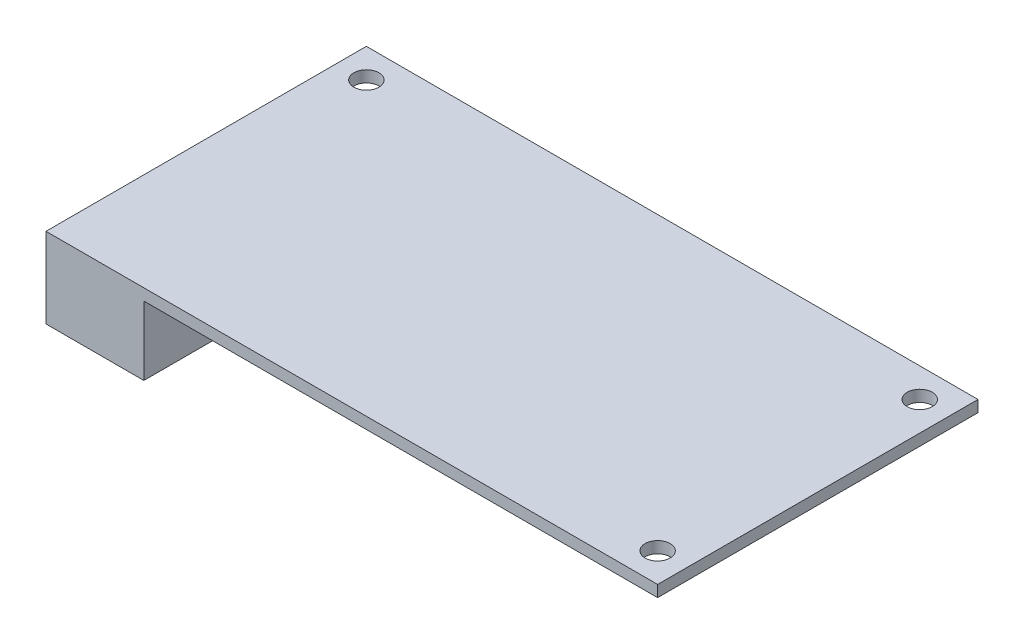
ISO-10303-21;
HEADER;
FILE_DESCRIPTION(('STEP AP214'),'2;1');
FILE_NAME('part.step','',(''),(''),'','','');
FILE_SCHEMA(('AUTOMOTIVE_DESIGN { 1 0 10303 214 1 1 1 1 }'));
ENDSEC;
DATA;
#1=APPLICATION_CONTEXT('core data for automotive mechanical design processes');
#2=APPLICATION_PROTOCOL_DEFINITION('international standard','automotive_design',2000,#1);
#3=PRODUCT_CONTEXT('',#1,'mechanical');
#4=PRODUCT('Part','Part','',(#3));
#5=PRODUCT_RELATED_PRODUCT_CATEGORY('part','',(#4));
#6=PRODUCT_DEFINITION_FORMATION('','',#4);
#7=PRODUCT_DEFINITION_CONTEXT('part definition',#1,'design');
#8=PRODUCT_DEFINITION('design','',#6,#7);
#9=PRODUCT_DEFINITION_SHAPE('','',#8);
#10=(LENGTH_UNIT() NAMED_UNIT(*) SI_UNIT(.MILLI.,.METRE.));
#11=(NAMED_UNIT(*) PLANE_ANGLE_UNIT() SI_UNIT($,.RADIAN.));
#12=(NAMED_UNIT(*) SI_UNIT($,.STERADIAN.) SOLID_ANGLE_UNIT());
#13=UNCERTAINTY_MEASURE_WITH_UNIT(LENGTH_MEASURE(1.E-05),#10,'distance_accuracy_value','');
#14=(GEOMETRIC_REPRESENTATION_CONTEXT(3) GLOBAL_UNCERTAINTY_ASSIGNED_CONTEXT((#13)) GLOBAL_UNIT_ASSIGNED_CONTEXT((#10,
#11,#12)) REPRESENTATION_CONTEXT('',''));
#15=CARTESIAN_POINT('',(0.,0.,0.));
#16=DIRECTION('',(0.,0.,1.));
#17=DIRECTION('',(1.,0.,0.));
#18=AXIS2_PLACEMENT_3D('',#15,#16,#17);
#19=CARTESIAN_POINT('',(0.,1.,0.));
#20=DIRECTION('',(0.,-1.,0.));
#21=DIRECTION('',(0.,0.,-1.));
#22=AXIS2_PLACEMENT_3D('',#19,#20,#21);
#23=PLANE('',#22);
#24=DIRECTION('',(-1.,0.,0.));
#25=VECTOR('',#24,1.);
#26=CARTESIAN_POINT('',(-26.67,1.,-13.97));
#27=LINE('',#26,#25);
#28=CARTESIAN_POINT('',(26.67,1.,-13.97));
#29=VERTEX_POINT('',#28);
#30=CARTESIAN_POINT('',(-26.67,1.,-13.97));
#31=VERTEX_POINT('',#30);
#32=EDGE_CURVE('E196',#29,#31,#27,.T.);
#33=ORIENTED_EDGE('',*,*,#32,.T.);
#34=DIRECTION('',(0.,0.,1.));
#35=VECTOR('',#34,1.);
#36=CARTESIAN_POINT('',(-26.67,1.,13.97));
#37=LINE('',#36,#35);
#38=CARTESIAN_POINT('',(-26.67,1.,13.97));
#39=VERTEX_POINT('',#38);
#40=EDGE_CURVE('E199',#31,#39,#37,.T.);
#41=ORIENTED_EDGE('',*,*,#40,.T.);
#42=DIRECTION('',(1.,0.,0.));
#43=VECTOR('',#42,1.);
#44=CARTESIAN_POINT('',(-26.67,1.,13.97));
#45=LINE('',#44,#43);
#46=CARTESIAN_POINT('',(26.67,1.,13.97));
#47=VERTEX_POINT('',#46);
#48=EDGE_CURVE('E201',#39,#47,#45,.T.);
#49=ORIENTED_EDGE('',*,*,#48,.T.);
#50=DIRECTION('',(0.,0.,-1.));
#51=VECTOR('',#50,1.);
#52=CARTESIAN_POINT('',(26.67,1.,13.97));
#53=LINE('',#52,#51);
#54=EDGE_CURVE('E193',#47,#29,#53,.T.);
#55=ORIENTED_EDGE('',*,*,#54,.T.);
#56=EDGE_LOOP('',(#33,#41,#49,#55));
#57=FACE_BOUND('',#56,.T.);
#58=CARTESIAN_POINT('',(-24.13,1.,-11.43));
#59=DIRECTION('',(0.,1.,0.));
#60=DIRECTION('',(0.,0.,1.));
#61=AXIS2_PLACEMENT_3D('',#58,#59,#60);
#62=CIRCLE('',#61,1.0922);
#63=CARTESIAN_POINT('',(-24.13,1.,-10.3378));
#64=VERTEX_POINT('',#63);
#65=EDGE_CURVE('E187',#64,#64,#62,.T.);
#66=ORIENTED_EDGE('',*,*,#65,.F.);
#67=EDGE_LOOP('',(#66));
#68=FACE_BOUND('',#67,.T.);
#69=CARTESIAN_POINT('',(24.13,1.,-11.43));
#70=DIRECTION('',(0.,1.,0.));
#71=DIRECTION('',(0.,0.,1.));
#72=AXIS2_PLACEMENT_3D('',#69,#70,#71);
#73=CIRCLE('',#72,1.0922);
#74=CARTESIAN_POINT('',(24.13,1.,-10.3378));
#75=VERTEX_POINT('',#74);
#76=EDGE_CURVE('E181',#75,#75,#73,.T.);
#77=ORIENTED_EDGE('',*,*,#76,.F.);
#78=EDGE_LOOP('',(#77));
#79=FACE_BOUND('',#78,.T.);
#80=CARTESIAN_POINT('',(24.13,1.,11.43));
#81=DIRECTION('',(0.,1.,0.));
#82=DIRECTION('',(0.,0.,1.));
#83=AXIS2_PLACEMENT_3D('',#80,#81,#82);
#84=CIRCLE('',#83,1.0922);
#85=CARTESIAN_POINT('',(24.13,1.,12.5222));
#86=VERTEX_POINT('',#85);
#87=EDGE_CURVE('E175',#86,#86,#84,.T.);
#88=ORIENTED_EDGE('',*,*,#87,.F.);
#89=EDGE_LOOP('',(#88));
#90=FACE_BOUND('',#89,.T.);
#91=ADVANCED_FACE('F34',(#57,#68,#79,#90),#23,.F.);
#92=CARTESIAN_POINT('',(0.,0.,0.));
#93=DIRECTION('',(0.,-1.,0.));
#94=DIRECTION('',(0.,0.,-1.));
#95=AXIS2_PLACEMENT_3D('',#92,#93,#94);
#96=PLANE('',#95);
#97=DIRECTION('',(0.,0.,-1.));
#98=VECTOR('',#97,1.);
#99=CARTESIAN_POINT('',(-5.18182766884214,0.,0.));
#100=LINE('',#99,#98);
#101=CARTESIAN_POINT('',(-5.18182766884214,0.,-6.44129967168573));
#102=VERTEX_POINT('',#101);
#103=CARTESIAN_POINT('',(-5.18182766884214,0.,-13.97));
#104=VERTEX_POINT('',#103);
#105=EDGE_CURVE('E148',#102,#104,#100,.T.);
#106=ORIENTED_EDGE('',*,*,#105,.F.);
#107=DIRECTION('',(-1.,0.,0.));
#108=VECTOR('',#107,1.);
#109=CARTESIAN_POINT('',(0.,0.,-6.44129967168573));
#110=LINE('',#109,#108);
#111=CARTESIAN_POINT('',(5.06187795428562,0.,-6.44129967168573));
#112=VERTEX_POINT('',#111);
#113=EDGE_CURVE('E11',#112,#102,#110,.T.);
#114=ORIENTED_EDGE('',*,*,#113,.F.);
#115=DIRECTION('',(0.,0.,1.));
#116=VECTOR('',#115,1.);
#117=CARTESIAN_POINT('',(5.06187795428562,0.,0.));
#118=LINE('',#117,#116);
#119=CARTESIAN_POINT('',(5.06187795428562,0.,-13.97));
#120=VERTEX_POINT('',#119);
#121=EDGE_CURVE('E142',#120,#112,#118,.T.);
#122=ORIENTED_EDGE('',*,*,#121,.F.);
#123=DIRECTION('',(-1.,0.,0.));
#124=VECTOR('',#123,1.);
#125=CARTESIAN_POINT('',(-26.67,0.,-13.97));
#126=LINE('',#125,#124);
#127=CARTESIAN_POINT('',(26.67,0.,-13.97));
#128=VERTEX_POINT('',#127);
#129=EDGE_CURVE('E206',#128,#120,#126,.T.);
#130=ORIENTED_EDGE('',*,*,#129,.F.);
#131=DIRECTION('',(0.,0.,-1.));
#132=VECTOR('',#131,1.);
#133=CARTESIAN_POINT('',(26.67,0.,13.97));
#134=LINE('',#133,#132);
#135=CARTESIAN_POINT('',(26.67,0.,13.97));
#136=VERTEX_POINT('',#135);
#137=EDGE_CURVE('E190',#136,#128,#134,.T.);
#138=ORIENTED_EDGE('',*,*,#137,.F.);
#139=DIRECTION('',(1.,0.,0.));
#140=VECTOR('',#139,1.);
#141=CARTESIAN_POINT('',(-26.67,0.,13.97));
#142=LINE('',#141,#140);
#143=CARTESIAN_POINT('',(-18.1363968409475,0.,13.97));
#144=VERTEX_POINT('',#143);
#145=EDGE_CURVE('E197',#144,#136,#142,.T.);
#146=ORIENTED_EDGE('',*,*,#145,.F.);
#147=DIRECTION('',(0.,0.,1.));
#148=VECTOR('',#147,1.);
#149=CARTESIAN_POINT('',(-18.1363968409475,0.,0.));
#150=LINE('',#149,#148);
#151=CARTESIAN_POINT('',(-18.1363968409475,0.,-5.91352092763699));
#152=VERTEX_POINT('',#151);
#153=EDGE_CURVE('E165',#152,#144,#150,.T.);
#154=ORIENTED_EDGE('',*,*,#153,.F.);
#155=DIRECTION('',(1.,0.,0.));
#156=VECTOR('',#155,1.);
#157=CARTESIAN_POINT('',(0.,0.,-5.91352092763699));
#158=LINE('',#157,#156);
#159=CARTESIAN_POINT('',(-26.67,0.,-5.91352092763699));
#160=VERTEX_POINT('',#159);
#161=EDGE_CURVE('E172',#160,#152,#158,.T.);
#162=ORIENTED_EDGE('',*,*,#161,.F.);
#163=DIRECTION('',(0.,0.,1.));
#164=VECTOR('',#163,1.);
#165=CARTESIAN_POINT('',(-26.67,0.,13.97));
#166=LINE('',#165,#164);
#167=CARTESIAN_POINT('',(-26.67,0.,-13.97));
#168=VERTEX_POINT('',#167);
#169=EDGE_CURVE('E209',#168,#160,#166,.T.);
#170=ORIENTED_EDGE('',*,*,#169,.F.);
#171=EDGE_CURVE('E53',#104,#168,#126,.T.);
#172=ORIENTED_EDGE('',*,*,#171,.F.);
#173=EDGE_LOOP('',(#106,#114,#122,#130,#138,#146,#154,#162,#170,#172));
#174=FACE_BOUND('',#173,.T.);
#175=CARTESIAN_POINT('',(24.13,0.,-11.43));
#176=DIRECTION('',(0.,1.,0.));
#177=DIRECTION('',(0.,0.,1.));
#178=AXIS2_PLACEMENT_3D('',#175,#176,#177);
#179=CIRCLE('',#178,1.0922);
#180=CARTESIAN_POINT('',(24.13,0.,-10.3378));
#181=VERTEX_POINT('',#180);
#182=EDGE_CURVE('E178',#181,#181,#179,.T.);
#183=ORIENTED_EDGE('',*,*,#182,.T.);
#184=EDGE_LOOP('',(#183));
#185=FACE_BOUND('',#184,.T.);
#186=CARTESIAN_POINT('',(-24.13,0.,-11.43));
#187=DIRECTION('',(0.,1.,0.));
#188=DIRECTION('',(0.,0.,1.));
#189=AXIS2_PLACEMENT_3D('',#186,#187,#188);
#190=CIRCLE('',#189,1.0922);
#191=CARTESIAN_POINT('',(-24.13,0.,-10.3378));
#192=VERTEX_POINT('',#191);
#193=EDGE_CURVE('E184',#192,#192,#190,.T.);
#194=ORIENTED_EDGE('',*,*,#193,.T.);
#195=EDGE_LOOP('',(#194));
#196=FACE_BOUND('',#195,.T.);
#197=CARTESIAN_POINT('',(24.13,0.,11.43));
#198=DIRECTION('',(0.,1.,0.));
#199=DIRECTION('',(0.,0.,1.));
#200=AXIS2_PLACEMENT_3D('',#197,#198,#199);
#201=CIRCLE('',#200,1.0922);
#202=CARTESIAN_POINT('',(24.13,0.,12.5222));
#203=VERTEX_POINT('',#202);
#204=EDGE_CURVE('E174',#203,#203,#201,.T.);
#205=ORIENTED_EDGE('',*,*,#204,.T.);
#206=EDGE_LOOP('',(#205));
#207=FACE_BOUND('',#206,.T.);
#208=ADVANCED_FACE('F229',(#174,#185,#196,#207),#96,.T.);
#209=CARTESIAN_POINT('',(26.67,1.,13.97));
#210=DIRECTION('',(-1.,0.,0.));
#211=DIRECTION('',(0.,0.,1.));
#212=AXIS2_PLACEMENT_3D('',#209,#210,#211);
#213=PLANE('',#212);
#214=ORIENTED_EDGE('',*,*,#137,.T.);
#215=DIRECTION('',(0.,-1.,0.));
#216=VECTOR('',#215,1.);
#217=CARTESIAN_POINT('',(26.67,1.,-13.97));
#218=LINE('',#217,#216);
#219=EDGE_CURVE('E42',#29,#128,#218,.T.);
#220=ORIENTED_EDGE('',*,*,#219,.F.);
#221=ORIENTED_EDGE('',*,*,#54,.F.);
#222=DIRECTION('',(0.,-1.,0.));
#223=VECTOR('',#222,1.);
#224=CARTESIAN_POINT('',(26.67,1.,13.97));
#225=LINE('',#224,#223);
#226=EDGE_CURVE('E203',#47,#136,#225,.T.);
#227=ORIENTED_EDGE('',*,*,#226,.T.);
#228=EDGE_LOOP('',(#214,#220,#221,#227));
#229=FACE_BOUND('',#228,.T.);
#230=ADVANCED_FACE('F36',(#229),#213,.F.);
#231=CARTESIAN_POINT('',(-26.67,1.,-13.97));
#232=DIRECTION('',(0.,0.,1.));
#233=DIRECTION('',(1.,0.,0.));
#234=AXIS2_PLACEMENT_3D('',#231,#232,#233);
#235=PLANE('',#234);
#236=ORIENTED_EDGE('',*,*,#129,.T.);
#237=DIRECTION('',(0.,1.,0.));
#238=VECTOR('',#237,1.);
#239=CARTESIAN_POINT('',(5.06187795428562,-6.,-13.97));
#240=LINE('',#239,#238);
#241=CARTESIAN_POINT('',(5.06187795428562,-6.,-13.97));
#242=VERTEX_POINT('',#241);
#243=EDGE_CURVE('E143',#242,#120,#240,.T.);
#244=ORIENTED_EDGE('',*,*,#243,.F.);
#245=DIRECTION('',(-1.,0.,0.));
#246=VECTOR('',#245,1.);
#247=CARTESIAN_POINT('',(-5.18182766884214,-6.,-13.97));
#248=LINE('',#247,#246);
#249=CARTESIAN_POINT('',(-5.18182766884214,-6.,-13.97));
#250=VERTEX_POINT('',#249);
#251=EDGE_CURVE('E122',#242,#250,#248,.T.);
#252=ORIENTED_EDGE('',*,*,#251,.T.);
#253=DIRECTION('',(0.,1.,0.));
#254=VECTOR('',#253,1.);
#255=CARTESIAN_POINT('',(-5.18182766884214,-6.,-13.97));
#256=LINE('',#255,#254);
#257=EDGE_CURVE('E136',#250,#104,#256,.T.);
#258=ORIENTED_EDGE('',*,*,#257,.T.);
#259=ORIENTED_EDGE('',*,*,#171,.T.);
#260=DIRECTION('',(0.,-1.,0.));
#261=VECTOR('',#260,1.);
#262=CARTESIAN_POINT('',(-26.67,1.,-13.97));
#263=LINE('',#262,#261);
#264=EDGE_CURVE('E217',#31,#168,#263,.T.);
#265=ORIENTED_EDGE('',*,*,#264,.F.);
#266=ORIENTED_EDGE('',*,*,#32,.F.);
#267=ORIENTED_EDGE('',*,*,#219,.T.);
#268=EDGE_LOOP('',(#236,#244,#252,#258,#259,#265,#266,#267));
#269=FACE_BOUND('',#268,.T.);
#270=ADVANCED_FACE('F222',(#269),#235,.F.);
#271=CARTESIAN_POINT('',(-26.67,1.,13.97));
#272=DIRECTION('',(1.,0.,0.));
#273=DIRECTION('',(0.,0.,-1.));
#274=AXIS2_PLACEMENT_3D('',#271,#272,#273);
#275=PLANE('',#274);
#276=ORIENTED_EDGE('',*,*,#169,.T.);
#277=DIRECTION('',(0.,1.,0.));
#278=VECTOR('',#277,1.);
#279=CARTESIAN_POINT('',(-26.67,-6.,-5.91352092763699));
#280=LINE('',#279,#278);
#281=CARTESIAN_POINT('',(-26.67,-6.,-5.91352092763699));
#282=VERTEX_POINT('',#281);
#283=EDGE_CURVE('E163',#282,#160,#280,.T.);
#284=ORIENTED_EDGE('',*,*,#283,.F.);
#285=DIRECTION('',(0.,0.,1.));
#286=VECTOR('',#285,1.);
#287=CARTESIAN_POINT('',(-26.67,-6.,-5.91352092763699));
#288=LINE('',#287,#286);
#289=CARTESIAN_POINT('',(-26.67,-6.,13.97));
#290=VERTEX_POINT('',#289);
#291=EDGE_CURVE('E150',#282,#290,#288,.T.);
#292=ORIENTED_EDGE('',*,*,#291,.T.);
#293=DIRECTION('',(0.,-1.,0.));
#294=VECTOR('',#293,1.);
#295=CARTESIAN_POINT('',(-26.67,1.,13.97));
#296=LINE('',#295,#294);
#297=EDGE_CURVE('E215',#39,#290,#296,.T.);
#298=ORIENTED_EDGE('',*,*,#297,.F.);
#299=ORIENTED_EDGE('',*,*,#40,.F.);
#300=ORIENTED_EDGE('',*,*,#264,.T.);
#301=EDGE_LOOP('',(#276,#284,#292,#298,#299,#300));
#302=FACE_BOUND('',#301,.T.);
#303=ADVANCED_FACE('F236',(#302),#275,.F.);
#304=CARTESIAN_POINT('',(-26.67,1.,13.97));
#305=DIRECTION('',(0.,0.,-1.));
#306=DIRECTION('',(-1.,0.,0.));
#307=AXIS2_PLACEMENT_3D('',#304,#305,#306);
#308=PLANE('',#307);
#309=ORIENTED_EDGE('',*,*,#226,.F.);
#310=ORIENTED_EDGE('',*,*,#48,.F.);
#311=ORIENTED_EDGE('',*,*,#297,.T.);
#312=DIRECTION('',(1.,0.,0.));
#313=VECTOR('',#312,1.);
#314=CARTESIAN_POINT('',(-26.67,-6.,13.97));
#315=LINE('',#314,#313);
#316=CARTESIAN_POINT('',(-18.1363968409475,-6.,13.97));
#317=VERTEX_POINT('',#316);
#318=EDGE_CURVE('E153',#290,#317,#315,.T.);
#319=ORIENTED_EDGE('',*,*,#318,.T.);
#320=DIRECTION('',(0.,1.,0.));
#321=VECTOR('',#320,1.);
#322=CARTESIAN_POINT('',(-18.1363968409475,-6.,13.97));
#323=LINE('',#322,#321);
#324=EDGE_CURVE('E162',#317,#144,#323,.T.);
#325=ORIENTED_EDGE('',*,*,#324,.T.);
#326=ORIENTED_EDGE('',*,*,#145,.T.);
#327=EDGE_LOOP('',(#309,#310,#311,#319,#325,#326));
#328=FACE_BOUND('',#327,.T.);
#329=ADVANCED_FACE('F251',(#328),#308,.F.);
#330=CARTESIAN_POINT('',(-24.13,1.,-11.43));
#331=DIRECTION('',(0.,-1.,0.));
#332=DIRECTION('',(0.,0.,-1.));
#333=AXIS2_PLACEMENT_3D('',#330,#331,#332);
#334=CYLINDRICAL_SURFACE('',#333,1.0922);
#335=ORIENTED_EDGE('',*,*,#65,.T.);
#336=EDGE_LOOP('',(#335));
#337=FACE_BOUND('',#336,.T.);
#338=ORIENTED_EDGE('',*,*,#193,.F.);
#339=EDGE_LOOP('',(#338));
#340=FACE_BOUND('',#339,.T.);
#341=ADVANCED_FACE('F278',(#337,#340),#334,.F.);
#342=CARTESIAN_POINT('',(24.13,1.,-11.43));
#343=DIRECTION('',(0.,-1.,0.));
#344=DIRECTION('',(0.,0.,-1.));
#345=AXIS2_PLACEMENT_3D('',#342,#343,#344);
#346=CYLINDRICAL_SURFACE('',#345,1.0922);
#347=ORIENTED_EDGE('',*,*,#76,.T.);
#348=EDGE_LOOP('',(#347));
#349=FACE_BOUND('',#348,.T.);
#350=ORIENTED_EDGE('',*,*,#182,.F.);
#351=EDGE_LOOP('',(#350));
#352=FACE_BOUND('',#351,.T.);
#353=ADVANCED_FACE('F265',(#349,#352),#346,.F.);
#354=CARTESIAN_POINT('',(24.13,1.,11.43));
#355=DIRECTION('',(0.,-1.,0.));
#356=DIRECTION('',(0.,0.,-1.));
#357=AXIS2_PLACEMENT_3D('',#354,#355,#356);
#358=CYLINDRICAL_SURFACE('',#357,1.0922);
#359=ORIENTED_EDGE('',*,*,#87,.T.);
#360=EDGE_LOOP('',(#359));
#361=FACE_BOUND('',#360,.T.);
#362=ORIENTED_EDGE('',*,*,#204,.F.);
#363=EDGE_LOOP('',(#362));
#364=FACE_BOUND('',#363,.T.);
#365=ADVANCED_FACE('F262',(#361,#364),#358,.F.);
#366=CARTESIAN_POINT('',(-26.67,-6.,-5.91352092763699));
#367=DIRECTION('',(0.,0.,-1.));
#368=DIRECTION('',(-1.,0.,0.));
#369=AXIS2_PLACEMENT_3D('',#366,#367,#368);
#370=PLANE('',#369);
#371=ORIENTED_EDGE('',*,*,#283,.T.);
#372=ORIENTED_EDGE('',*,*,#161,.T.);
#373=DIRECTION('',(0.,1.,0.));
#374=VECTOR('',#373,1.);
#375=CARTESIAN_POINT('',(-18.1363968409475,-6.,-5.91352092763699));
#376=LINE('',#375,#374);
#377=CARTESIAN_POINT('',(-18.1363968409475,-6.,-5.91352092763699));
#378=VERTEX_POINT('',#377);
#379=EDGE_CURVE('E166',#378,#152,#376,.T.);
#380=ORIENTED_EDGE('',*,*,#379,.F.);
#381=DIRECTION('',(-1.,0.,0.));
#382=VECTOR('',#381,1.);
#383=CARTESIAN_POINT('',(-26.67,-6.,-5.91352092763699));
#384=LINE('',#383,#382);
#385=EDGE_CURVE('E159',#378,#282,#384,.T.);
#386=ORIENTED_EDGE('',*,*,#385,.T.);
#387=EDGE_LOOP('',(#371,#372,#380,#386));
#388=FACE_BOUND('',#387,.T.);
#389=ADVANCED_FACE('F240',(#388),#370,.T.);
#390=CARTESIAN_POINT('',(-18.1363968409475,-6.,-5.91352092763699));
#391=DIRECTION('',(1.,0.,0.));
#392=DIRECTION('',(0.,0.,-1.));
#393=AXIS2_PLACEMENT_3D('',#390,#391,#392);
#394=PLANE('',#393);
#395=ORIENTED_EDGE('',*,*,#379,.T.);
#396=ORIENTED_EDGE('',*,*,#153,.T.);
#397=ORIENTED_EDGE('',*,*,#324,.F.);
#398=DIRECTION('',(0.,0.,-1.));
#399=VECTOR('',#398,1.);
#400=CARTESIAN_POINT('',(-18.1363968409475,-6.,-5.91352092763699));
#401=LINE('',#400,#399);
#402=EDGE_CURVE('E156',#317,#378,#401,.T.);
#403=ORIENTED_EDGE('',*,*,#402,.T.);
#404=EDGE_LOOP('',(#395,#396,#397,#403));
#405=FACE_BOUND('',#404,.T.);
#406=ADVANCED_FACE('F242',(#405),#394,.T.);
#407=CARTESIAN_POINT('',(0.,-6.,0.));
#408=DIRECTION('',(0.,1.,0.));
#409=DIRECTION('',(0.,0.,1.));
#410=AXIS2_PLACEMENT_3D('',#407,#408,#409);
#411=PLANE('',#410);
#412=ORIENTED_EDGE('',*,*,#291,.F.);
#413=ORIENTED_EDGE('',*,*,#385,.F.);
#414=ORIENTED_EDGE('',*,*,#402,.F.);
#415=ORIENTED_EDGE('',*,*,#318,.F.);
#416=EDGE_LOOP('',(#412,#413,#414,#415));
#417=FACE_BOUND('',#416,.T.);
#418=ADVANCED_FACE('F248',(#417),#411,.F.);
#419=CARTESIAN_POINT('',(-5.18182766884214,-6.,-13.97));
#420=DIRECTION('',(-1.,0.,0.));
#421=DIRECTION('',(0.,0.,1.));
#422=AXIS2_PLACEMENT_3D('',#419,#420,#421);
#423=PLANE('',#422);
#424=DIRECTION('',(0.,1.,0.));
#425=VECTOR('',#424,1.);
#426=CARTESIAN_POINT('',(-5.18182766884214,-6.,-6.44129967168573));
#427=LINE('',#426,#425);
#428=CARTESIAN_POINT('',(-5.18182766884214,-6.,-6.44129967168573));
#429=VERTEX_POINT('',#428);
#430=EDGE_CURVE('E114',#429,#102,#427,.T.);
#431=ORIENTED_EDGE('',*,*,#430,.T.);
#432=ORIENTED_EDGE('',*,*,#105,.T.);
#433=ORIENTED_EDGE('',*,*,#257,.F.);
#434=DIRECTION('',(0.,0.,1.));
#435=VECTOR('',#434,1.);
#436=CARTESIAN_POINT('',(-5.18182766884214,-6.,-13.97));
#437=LINE('',#436,#435);
#438=EDGE_CURVE('E129',#250,#429,#437,.T.);
#439=ORIENTED_EDGE('',*,*,#438,.T.);
#440=EDGE_LOOP('',(#431,#432,#433,#439));
#441=FACE_BOUND('',#440,.T.);
#442=ADVANCED_FACE('F134',(#441),#423,.T.);
#443=CARTESIAN_POINT('',(5.06187795428562,-6.,-13.97));
#444=DIRECTION('',(1.,0.,0.));
#445=DIRECTION('',(0.,0.,-1.));
#446=AXIS2_PLACEMENT_3D('',#443,#444,#445);
#447=PLANE('',#446);
#448=ORIENTED_EDGE('',*,*,#243,.T.);
#449=ORIENTED_EDGE('',*,*,#121,.T.);
#450=DIRECTION('',(0.,1.,0.));
#451=VECTOR('',#450,1.);
#452=CARTESIAN_POINT('',(5.06187795428562,-6.,-6.44129967168573));
#453=LINE('',#452,#451);
#454=CARTESIAN_POINT('',(5.06187795428562,-6.,-6.44129967168573));
#455=VERTEX_POINT('',#454);
#456=EDGE_CURVE('E121',#455,#112,#453,.T.);
#457=ORIENTED_EDGE('',*,*,#456,.F.);
#458=DIRECTION('',(0.,0.,-1.));
#459=VECTOR('',#458,1.);
#460=CARTESIAN_POINT('',(5.06187795428562,-6.,-13.97));
#461=LINE('',#460,#459);
#462=EDGE_CURVE('E132',#455,#242,#461,.T.);
#463=ORIENTED_EDGE('',*,*,#462,.T.);
#464=EDGE_LOOP('',(#448,#449,#457,#463));
#465=FACE_BOUND('',#464,.T.);
#466=ADVANCED_FACE('F233',(#465),#447,.T.);
#467=CARTESIAN_POINT('',(-5.18182766884214,-6.,-6.44129967168573));
#468=DIRECTION('',(0.,0.,1.));
#469=DIRECTION('',(1.,0.,0.));
#470=AXIS2_PLACEMENT_3D('',#467,#468,#469);
#471=PLANE('',#470);
#472=ORIENTED_EDGE('',*,*,#456,.T.);
#473=ORIENTED_EDGE('',*,*,#113,.T.);
#474=ORIENTED_EDGE('',*,*,#430,.F.);
#475=DIRECTION('',(1.,0.,0.));
#476=VECTOR('',#475,1.);
#477=CARTESIAN_POINT('',(-5.18182766884214,-6.,-6.44129967168573));
#478=LINE('',#477,#476);
#479=EDGE_CURVE('E118',#429,#455,#478,.T.);
#480=ORIENTED_EDGE('',*,*,#479,.T.);
#481=EDGE_LOOP('',(#472,#473,#474,#480));
#482=FACE_BOUND('',#481,.T.);
#483=ADVANCED_FACE('F117',(#482),#471,.T.);
#484=CARTESIAN_POINT('',(0.,-6.,0.));
#485=DIRECTION('',(0.,1.,0.));
#486=DIRECTION('',(0.,0.,1.));
#487=AXIS2_PLACEMENT_3D('',#484,#485,#486);
#488=PLANE('',#487);
#489=ORIENTED_EDGE('',*,*,#438,.F.);
#490=ORIENTED_EDGE('',*,*,#251,.F.);
#491=ORIENTED_EDGE('',*,*,#462,.F.);
#492=ORIENTED_EDGE('',*,*,#479,.F.);
#493=EDGE_LOOP('',(#489,#490,#491,#492));
#494=FACE_BOUND('',#493,.T.);
#495=ADVANCED_FACE('F127',(#494),#488,.F.);
#496=CLOSED_SHELL('',(#91,#208,#230,#270,#303,#329,#341,#353,#365,#389,#406,#418,#442,#466,#483,#495));
#497=MANIFOLD_SOLID_BREP('B2',#496);
#498=ADVANCED_BREP_SHAPE_REPRESENTATION('',(#18,#497),#14);
#499=SHAPE_DEFINITION_REPRESENTATION(#9,#498);
ENDSEC;
END-ISO-10303-21;
